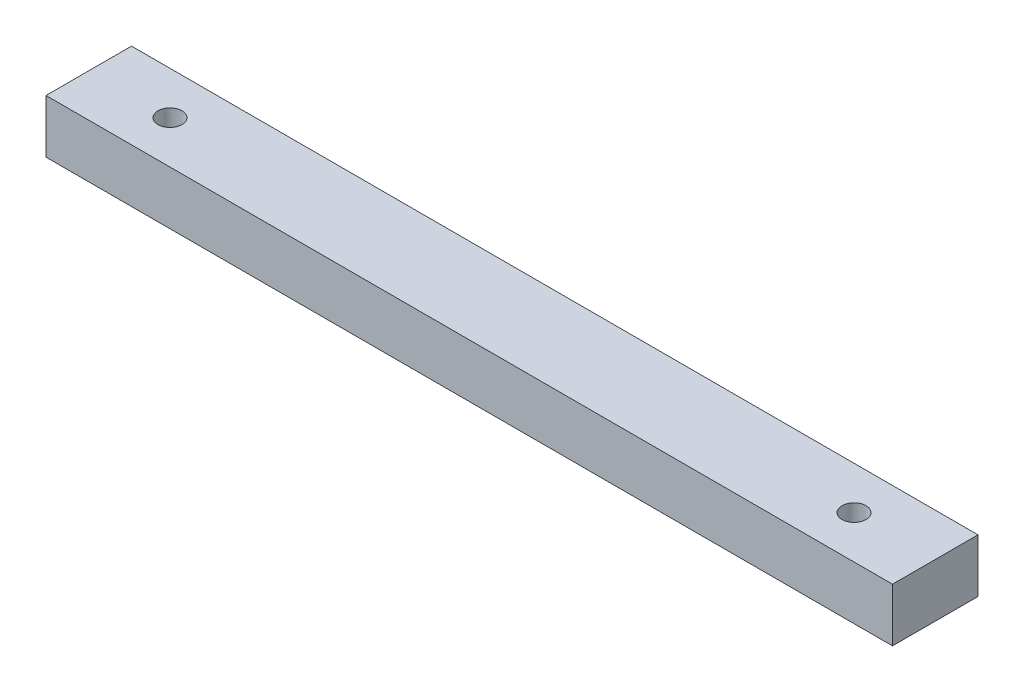
ISO-10303-21;
HEADER;
FILE_DESCRIPTION(('STEP AP214'),'2;1');
FILE_NAME('part.step','',(''),(''),'','','');
FILE_SCHEMA(('AUTOMOTIVE_DESIGN { 1 0 10303 214 1 1 1 1 }'));
ENDSEC;
DATA;
#1=APPLICATION_CONTEXT('core data for automotive mechanical design processes');
#2=APPLICATION_PROTOCOL_DEFINITION('international standard','automotive_design',2000,#1);
#3=PRODUCT_CONTEXT('',#1,'mechanical');
#4=PRODUCT('Part','Part','',(#3));
#5=PRODUCT_RELATED_PRODUCT_CATEGORY('part','',(#4));
#6=PRODUCT_DEFINITION_FORMATION('','',#4);
#7=PRODUCT_DEFINITION_CONTEXT('part definition',#1,'design');
#8=PRODUCT_DEFINITION('design','',#6,#7);
#9=PRODUCT_DEFINITION_SHAPE('','',#8);
#10=(LENGTH_UNIT() NAMED_UNIT(*) SI_UNIT(.MILLI.,.METRE.));
#11=(NAMED_UNIT(*) PLANE_ANGLE_UNIT() SI_UNIT($,.RADIAN.));
#12=(NAMED_UNIT(*) SI_UNIT($,.STERADIAN.) SOLID_ANGLE_UNIT());
#13=UNCERTAINTY_MEASURE_WITH_UNIT(LENGTH_MEASURE(1.E-05),#10,'distance_accuracy_value','');
#14=(GEOMETRIC_REPRESENTATION_CONTEXT(3) GLOBAL_UNCERTAINTY_ASSIGNED_CONTEXT((#13)) GLOBAL_UNIT_ASSIGNED_CONTEXT((#10,
#11,#12)) REPRESENTATION_CONTEXT('',''));
#15=CARTESIAN_POINT('',(0.,0.,0.));
#16=DIRECTION('',(0.,0.,1.));
#17=DIRECTION('',(1.,0.,0.));
#18=AXIS2_PLACEMENT_3D('',#15,#16,#17);
#19=CARTESIAN_POINT('',(125.73,7.9375,12.7));
#20=DIRECTION('',(0.,0.,-1.));
#21=DIRECTION('',(0.,1.,0.));
#22=AXIS2_PLACEMENT_3D('',#19,#20,#21);
#23=PLANE('',#22);
#24=DIRECTION('',(0.,-1.,0.));
#25=VECTOR('',#24,1.);
#26=CARTESIAN_POINT('',(-125.73,7.9375,12.7));
#27=LINE('',#26,#25);
#28=CARTESIAN_POINT('',(-125.73,7.9375,12.7));
#29=VERTEX_POINT('',#28);
#30=CARTESIAN_POINT('',(-125.73,-7.9375,12.7));
#31=VERTEX_POINT('',#30);
#32=EDGE_CURVE('E76',#29,#31,#27,.T.);
#33=ORIENTED_EDGE('',*,*,#32,.T.);
#34=DIRECTION('',(-1.,0.,0.));
#35=VECTOR('',#34,1.);
#36=CARTESIAN_POINT('',(125.73,-7.9375,12.7));
#37=LINE('',#36,#35);
#38=CARTESIAN_POINT('',(125.73,-7.9375,12.7));
#39=VERTEX_POINT('',#38);
#40=EDGE_CURVE('E11',#39,#31,#37,.T.);
#41=ORIENTED_EDGE('',*,*,#40,.F.);
#42=DIRECTION('',(0.,-1.,0.));
#43=VECTOR('',#42,1.);
#44=CARTESIAN_POINT('',(125.73,7.9375,12.7));
#45=LINE('',#44,#43);
#46=CARTESIAN_POINT('',(125.73,7.9375,12.7));
#47=VERTEX_POINT('',#46);
#48=EDGE_CURVE('E99',#47,#39,#45,.T.);
#49=ORIENTED_EDGE('',*,*,#48,.F.);
#50=DIRECTION('',(-1.,0.,0.));
#51=VECTOR('',#50,1.);
#52=CARTESIAN_POINT('',(125.73,7.9375,12.7));
#53=LINE('',#52,#51);
#54=EDGE_CURVE('E88',#47,#29,#53,.T.);
#55=ORIENTED_EDGE('',*,*,#54,.T.);
#56=EDGE_LOOP('',(#33,#41,#49,#55));
#57=FACE_BOUND('',#56,.T.);
#58=ADVANCED_FACE('F32',(#57),#23,.F.);
#59=CARTESIAN_POINT('',(125.73,-7.9375,12.7));
#60=DIRECTION('',(0.,1.,0.));
#61=DIRECTION('',(0.,0.,1.));
#62=AXIS2_PLACEMENT_3D('',#59,#60,#61);
#63=PLANE('',#62);
#64=CARTESIAN_POINT('',(101.6,-7.9375,0.));
#65=DIRECTION('',(0.,1.,0.));
#66=DIRECTION('',(0.,0.,1.));
#67=AXIS2_PLACEMENT_3D('',#64,#65,#66);
#68=CIRCLE('',#67,3.57124);
#69=CARTESIAN_POINT('',(101.6,-7.9375,3.57124));
#70=VERTEX_POINT('',#69);
#71=EDGE_CURVE('E134',#70,#70,#68,.T.);
#72=ORIENTED_EDGE('',*,*,#71,.T.);
#73=EDGE_LOOP('',(#72));
#74=FACE_BOUND('',#73,.T.);
#75=CARTESIAN_POINT('',(-101.6,-7.9375,0.));
#76=DIRECTION('',(0.,1.,0.));
#77=DIRECTION('',(0.,0.,1.));
#78=AXIS2_PLACEMENT_3D('',#75,#76,#77);
#79=CIRCLE('',#78,3.57124);
#80=CARTESIAN_POINT('',(-101.6,-7.9375,3.57124));
#81=VERTEX_POINT('',#80);
#82=EDGE_CURVE('E92',#81,#81,#79,.T.);
#83=ORIENTED_EDGE('',*,*,#82,.T.);
#84=EDGE_LOOP('',(#83));
#85=FACE_BOUND('',#84,.T.);
#86=DIRECTION('',(0.,0.,-1.));
#87=VECTOR('',#86,1.);
#88=CARTESIAN_POINT('',(-125.73,-7.9375,12.7));
#89=LINE('',#88,#87);
#90=CARTESIAN_POINT('',(-125.73,-7.9375,-12.7));
#91=VERTEX_POINT('',#90);
#92=EDGE_CURVE('E72',#31,#91,#89,.T.);
#93=ORIENTED_EDGE('',*,*,#92,.T.);
#94=DIRECTION('',(-1.,0.,0.));
#95=VECTOR('',#94,1.);
#96=CARTESIAN_POINT('',(125.73,-7.9375,-12.7));
#97=LINE('',#96,#95);
#98=CARTESIAN_POINT('',(125.73,-7.9375,-12.7));
#99=VERTEX_POINT('',#98);
#100=EDGE_CURVE('E39',#99,#91,#97,.T.);
#101=ORIENTED_EDGE('',*,*,#100,.F.);
#102=DIRECTION('',(0.,0.,-1.));
#103=VECTOR('',#102,1.);
#104=CARTESIAN_POINT('',(125.73,-7.9375,12.7));
#105=LINE('',#104,#103);
#106=EDGE_CURVE('E84',#39,#99,#105,.T.);
#107=ORIENTED_EDGE('',*,*,#106,.F.);
#108=ORIENTED_EDGE('',*,*,#40,.T.);
#109=EDGE_LOOP('',(#93,#101,#107,#108));
#110=FACE_BOUND('',#109,.T.);
#111=ADVANCED_FACE('F83',(#74,#85,#110),#63,.F.);
#112=CARTESIAN_POINT('',(125.73,7.9375,-12.7));
#113=DIRECTION('',(0.,0.,1.));
#114=DIRECTION('',(0.,-1.,0.));
#115=AXIS2_PLACEMENT_3D('',#112,#113,#114);
#116=PLANE('',#115);
#117=DIRECTION('',(0.,1.,0.));
#118=VECTOR('',#117,1.);
#119=CARTESIAN_POINT('',(-125.73,7.9375,-12.7));
#120=LINE('',#119,#118);
#121=CARTESIAN_POINT('',(-125.73,7.9375,-12.7));
#122=VERTEX_POINT('',#121);
#123=EDGE_CURVE('E77',#91,#122,#120,.T.);
#124=ORIENTED_EDGE('',*,*,#123,.T.);
#125=DIRECTION('',(-1.,0.,0.));
#126=VECTOR('',#125,1.);
#127=CARTESIAN_POINT('',(125.73,7.9375,-12.7));
#128=LINE('',#127,#126);
#129=CARTESIAN_POINT('',(125.73,7.9375,-12.7));
#130=VERTEX_POINT('',#129);
#131=EDGE_CURVE('E105',#130,#122,#128,.T.);
#132=ORIENTED_EDGE('',*,*,#131,.F.);
#133=DIRECTION('',(0.,1.,0.));
#134=VECTOR('',#133,1.);
#135=CARTESIAN_POINT('',(125.73,7.9375,-12.7));
#136=LINE('',#135,#134);
#137=EDGE_CURVE('E51',#99,#130,#136,.T.);
#138=ORIENTED_EDGE('',*,*,#137,.F.);
#139=ORIENTED_EDGE('',*,*,#100,.T.);
#140=EDGE_LOOP('',(#124,#132,#138,#139));
#141=FACE_BOUND('',#140,.T.);
#142=ADVANCED_FACE('F108',(#141),#116,.F.);
#143=CARTESIAN_POINT('',(125.73,7.9375,12.7));
#144=DIRECTION('',(0.,-1.,0.));
#145=DIRECTION('',(0.,0.,-1.));
#146=AXIS2_PLACEMENT_3D('',#143,#144,#145);
#147=PLANE('',#146);
#148=CARTESIAN_POINT('',(101.6,7.9375,0.));
#149=DIRECTION('',(0.,1.,0.));
#150=DIRECTION('',(0.,0.,1.));
#151=AXIS2_PLACEMENT_3D('',#148,#149,#150);
#152=CIRCLE('',#151,3.57123999999999);
#153=CARTESIAN_POINT('',(101.6,7.9375,3.57123999999999));
#154=VERTEX_POINT('',#153);
#155=EDGE_CURVE('E138',#154,#154,#152,.T.);
#156=ORIENTED_EDGE('',*,*,#155,.F.);
#157=EDGE_LOOP('',(#156));
#158=FACE_BOUND('',#157,.T.);
#159=CARTESIAN_POINT('',(-101.6,7.9375,0.));
#160=DIRECTION('',(0.,1.,0.));
#161=DIRECTION('',(0.,0.,1.));
#162=AXIS2_PLACEMENT_3D('',#159,#160,#161);
#163=CIRCLE('',#162,3.57123999999999);
#164=CARTESIAN_POINT('',(-101.6,7.9375,3.57123999999999));
#165=VERTEX_POINT('',#164);
#166=EDGE_CURVE('E89',#165,#165,#163,.T.);
#167=ORIENTED_EDGE('',*,*,#166,.F.);
#168=EDGE_LOOP('',(#167));
#169=FACE_BOUND('',#168,.T.);
#170=DIRECTION('',(0.,0.,1.));
#171=VECTOR('',#170,1.);
#172=CARTESIAN_POINT('',(-125.73,7.9375,12.7));
#173=LINE('',#172,#171);
#174=EDGE_CURVE('E97',#122,#29,#173,.T.);
#175=ORIENTED_EDGE('',*,*,#174,.T.);
#176=ORIENTED_EDGE('',*,*,#54,.F.);
#177=DIRECTION('',(0.,0.,1.));
#178=VECTOR('',#177,1.);
#179=CARTESIAN_POINT('',(125.73,7.9375,12.7));
#180=LINE('',#179,#178);
#181=EDGE_CURVE('E46',#130,#47,#180,.T.);
#182=ORIENTED_EDGE('',*,*,#181,.F.);
#183=ORIENTED_EDGE('',*,*,#131,.T.);
#184=EDGE_LOOP('',(#175,#176,#182,#183));
#185=FACE_BOUND('',#184,.T.);
#186=ADVANCED_FACE('F110',(#158,#169,#185),#147,.F.);
#187=CARTESIAN_POINT('',(125.73,-7.9375,12.7));
#188=DIRECTION('',(1.,0.,0.));
#189=DIRECTION('',(0.,0.,-1.));
#190=AXIS2_PLACEMENT_3D('',#187,#188,#189);
#191=PLANE('',#190);
#192=ORIENTED_EDGE('',*,*,#48,.T.);
#193=ORIENTED_EDGE('',*,*,#106,.T.);
#194=ORIENTED_EDGE('',*,*,#137,.T.);
#195=ORIENTED_EDGE('',*,*,#181,.T.);
#196=EDGE_LOOP('',(#192,#193,#194,#195));
#197=FACE_BOUND('',#196,.T.);
#198=ADVANCED_FACE('F111',(#197),#191,.T.);
#199=CARTESIAN_POINT('',(-125.73,-7.9375,12.7));
#200=DIRECTION('',(1.,0.,0.));
#201=DIRECTION('',(0.,0.,-1.));
#202=AXIS2_PLACEMENT_3D('',#199,#200,#201);
#203=PLANE('',#202);
#204=ORIENTED_EDGE('',*,*,#32,.F.);
#205=ORIENTED_EDGE('',*,*,#174,.F.);
#206=ORIENTED_EDGE('',*,*,#123,.F.);
#207=ORIENTED_EDGE('',*,*,#92,.F.);
#208=EDGE_LOOP('',(#204,#205,#206,#207));
#209=FACE_BOUND('',#208,.T.);
#210=ADVANCED_FACE('F73',(#209),#203,.F.);
#211=CARTESIAN_POINT('',(-101.6,7.9375,0.));
#212=DIRECTION('',(0.,1.,0.));
#213=DIRECTION('',(0.,0.,1.));
#214=AXIS2_PLACEMENT_3D('',#211,#212,#213);
#215=CYLINDRICAL_SURFACE('',#214,3.57124);
#216=ORIENTED_EDGE('',*,*,#82,.F.);
#217=EDGE_LOOP('',(#216));
#218=FACE_BOUND('',#217,.T.);
#219=ORIENTED_EDGE('',*,*,#166,.T.);
#220=EDGE_LOOP('',(#219));
#221=FACE_BOUND('',#220,.T.);
#222=ADVANCED_FACE('F118',(#218,#221),#215,.F.);
#223=CARTESIAN_POINT('',(101.6,7.9375,0.));
#224=DIRECTION('',(0.,1.,0.));
#225=DIRECTION('',(0.,0.,1.));
#226=AXIS2_PLACEMENT_3D('',#223,#224,#225);
#227=CYLINDRICAL_SURFACE('',#226,3.57124);
#228=ORIENTED_EDGE('',*,*,#71,.F.);
#229=EDGE_LOOP('',(#228));
#230=FACE_BOUND('',#229,.T.);
#231=ORIENTED_EDGE('',*,*,#155,.T.);
#232=EDGE_LOOP('',(#231));
#233=FACE_BOUND('',#232,.T.);
#234=ADVANCED_FACE('F144',(#230,#233),#227,.F.);
#235=CLOSED_SHELL('',(#58,#111,#142,#186,#198,#210,#222,#234));
#236=MANIFOLD_SOLID_BREP('B2',#235);
#237=ADVANCED_BREP_SHAPE_REPRESENTATION('',(#18,#236),#14);
#238=SHAPE_DEFINITION_REPRESENTATION(#9,#237);
ENDSEC;
END-ISO-10303-21;
